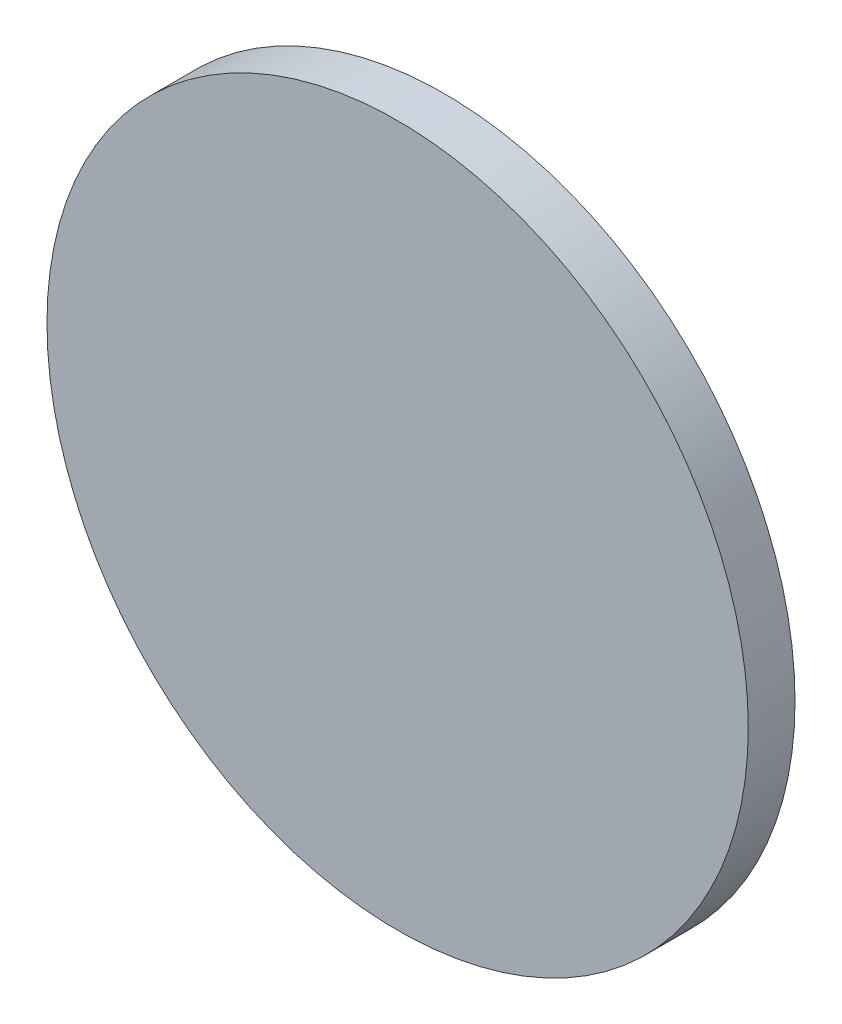
ISO-10303-21;
HEADER;
FILE_DESCRIPTION(('STEP AP214'),'2;1');
FILE_NAME('part.step','',(''),(''),'','','');
FILE_SCHEMA(('AUTOMOTIVE_DESIGN { 1 0 10303 214 1 1 1 1 }'));
ENDSEC;
DATA;
#1=APPLICATION_CONTEXT('core data for automotive mechanical design processes');
#2=APPLICATION_PROTOCOL_DEFINITION('international standard','automotive_design',2000,#1);
#3=PRODUCT_CONTEXT('',#1,'mechanical');
#4=PRODUCT('Part','Part','',(#3));
#5=PRODUCT_RELATED_PRODUCT_CATEGORY('part','',(#4));
#6=PRODUCT_DEFINITION_FORMATION('','',#4);
#7=PRODUCT_DEFINITION_CONTEXT('part definition',#1,'design');
#8=PRODUCT_DEFINITION('design','',#6,#7);
#9=PRODUCT_DEFINITION_SHAPE('','',#8);
#10=(LENGTH_UNIT() NAMED_UNIT(*) SI_UNIT(.MILLI.,.METRE.));
#11=(NAMED_UNIT(*) PLANE_ANGLE_UNIT() SI_UNIT($,.RADIAN.));
#12=(NAMED_UNIT(*) SI_UNIT($,.STERADIAN.) SOLID_ANGLE_UNIT());
#13=UNCERTAINTY_MEASURE_WITH_UNIT(LENGTH_MEASURE(1.E-05),#10,'distance_accuracy_value','');
#14=(GEOMETRIC_REPRESENTATION_CONTEXT(3) GLOBAL_UNCERTAINTY_ASSIGNED_CONTEXT((#13)) GLOBAL_UNIT_ASSIGNED_CONTEXT((#10,
#11,#12)) REPRESENTATION_CONTEXT('',''));
#15=CARTESIAN_POINT('',(0.,0.,0.));
#16=DIRECTION('',(0.,0.,1.));
#17=DIRECTION('',(1.,0.,0.));
#18=AXIS2_PLACEMENT_3D('',#15,#16,#17);
#19=CARTESIAN_POINT('',(0.,0.,8.));
#20=DIRECTION('',(0.,0.,-1.));
#21=DIRECTION('',(-1.,0.,0.));
#22=AXIS2_PLACEMENT_3D('',#19,#20,#21);
#23=CYLINDRICAL_SURFACE('',#22,60.);
#24=CARTESIAN_POINT('',(0.,0.,8.));
#25=DIRECTION('',(0.,0.,1.));
#26=DIRECTION('',(1.,0.,0.));
#27=AXIS2_PLACEMENT_3D('',#24,#25,#26);
#28=CIRCLE('',#27,60.);
#29=CARTESIAN_POINT('',(60.,0.,8.));
#30=VERTEX_POINT('',#29);
#31=EDGE_CURVE('E10',#30,#30,#28,.T.);
#32=ORIENTED_EDGE('',*,*,#31,.F.);
#33=EDGE_LOOP('',(#32));
#34=FACE_BOUND('',#33,.T.);
#35=CARTESIAN_POINT('',(0.,0.,0.));
#36=DIRECTION('',(0.,0.,1.));
#37=DIRECTION('',(1.,0.,0.));
#38=AXIS2_PLACEMENT_3D('',#35,#36,#37);
#39=CIRCLE('',#38,60.);
#40=CARTESIAN_POINT('',(60.,0.,0.));
#41=VERTEX_POINT('',#40);
#42=EDGE_CURVE('E34',#41,#41,#39,.T.);
#43=ORIENTED_EDGE('',*,*,#42,.T.);
#44=EDGE_LOOP('',(#43));
#45=FACE_BOUND('',#44,.T.);
#46=ADVANCED_FACE('F31',(#34,#45),#23,.T.);
#47=CARTESIAN_POINT('',(0.,0.,8.));
#48=DIRECTION('',(0.,0.,1.));
#49=DIRECTION('',(1.,0.,0.));
#50=AXIS2_PLACEMENT_3D('',#47,#48,#49);
#51=PLANE('',#50);
#52=ORIENTED_EDGE('',*,*,#31,.T.);
#53=EDGE_LOOP('',(#52));
#54=FACE_BOUND('',#53,.T.);
#55=ADVANCED_FACE('F46',(#54),#51,.T.);
#56=CARTESIAN_POINT('',(0.,0.,0.));
#57=DIRECTION('',(0.,0.,1.));
#58=DIRECTION('',(1.,0.,0.));
#59=AXIS2_PLACEMENT_3D('',#56,#57,#58);
#60=PLANE('',#59);
#61=ORIENTED_EDGE('',*,*,#42,.F.);
#62=EDGE_LOOP('',(#61));
#63=FACE_BOUND('',#62,.T.);
#64=ADVANCED_FACE('F44',(#63),#60,.F.);
#65=CLOSED_SHELL('',(#46,#55,#64));
#66=MANIFOLD_SOLID_BREP('B2',#65);
#67=ADVANCED_BREP_SHAPE_REPRESENTATION('',(#18,#66),#14);
#68=SHAPE_DEFINITION_REPRESENTATION(#9,#67);
ENDSEC;
END-ISO-10303-21;
